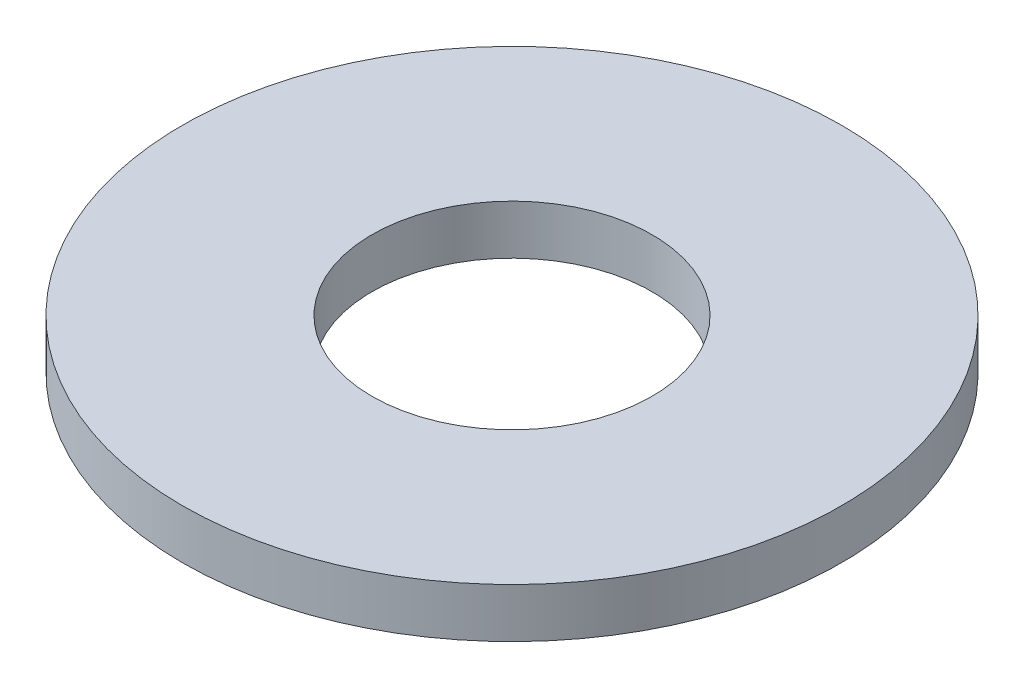
ISO-10303-21;
HEADER;
FILE_DESCRIPTION(('STEP AP214'),'2;1');
FILE_NAME('part.step','',(''),(''),'','','');
FILE_SCHEMA(('AUTOMOTIVE_DESIGN { 1 0 10303 214 1 1 1 1 }'));
ENDSEC;
DATA;
#1=APPLICATION_CONTEXT('core data for automotive mechanical design processes');
#2=APPLICATION_PROTOCOL_DEFINITION('international standard','automotive_design',2000,#1);
#3=PRODUCT_CONTEXT('',#1,'mechanical');
#4=PRODUCT('Part','Part','',(#3));
#5=PRODUCT_RELATED_PRODUCT_CATEGORY('part','',(#4));
#6=PRODUCT_DEFINITION_FORMATION('','',#4);
#7=PRODUCT_DEFINITION_CONTEXT('part definition',#1,'design');
#8=PRODUCT_DEFINITION('design','',#6,#7);
#9=PRODUCT_DEFINITION_SHAPE('','',#8);
#10=(LENGTH_UNIT() NAMED_UNIT(*) SI_UNIT(.MILLI.,.METRE.));
#11=(NAMED_UNIT(*) PLANE_ANGLE_UNIT() SI_UNIT($,.RADIAN.));
#12=(NAMED_UNIT(*) SI_UNIT($,.STERADIAN.) SOLID_ANGLE_UNIT());
#13=UNCERTAINTY_MEASURE_WITH_UNIT(LENGTH_MEASURE(1.E-05),#10,'distance_accuracy_value','');
#14=(GEOMETRIC_REPRESENTATION_CONTEXT(3) GLOBAL_UNCERTAINTY_ASSIGNED_CONTEXT((#13)) GLOBAL_UNIT_ASSIGNED_CONTEXT((#10,
#11,#12)) REPRESENTATION_CONTEXT('',''));
#15=CARTESIAN_POINT('',(0.,0.,0.));
#16=DIRECTION('',(0.,0.,1.));
#17=DIRECTION('',(1.,0.,0.));
#18=AXIS2_PLACEMENT_3D('',#15,#16,#17);
#19=CARTESIAN_POINT('',(0.,6.,0.));
#20=DIRECTION('',(0.,1.,0.));
#21=DIRECTION('',(0.,0.,1.));
#22=AXIS2_PLACEMENT_3D('',#19,#20,#21);
#23=PLANE('',#22);
#24=CARTESIAN_POINT('',(0.,6.,0.));
#25=DIRECTION('',(0.,1.,0.));
#26=DIRECTION('',(0.,0.,1.));
#27=AXIS2_PLACEMENT_3D('',#24,#25,#26);
#28=CIRCLE('',#27,40.);
#29=CARTESIAN_POINT('',(0.,6.,40.));
#30=VERTEX_POINT('',#29);
#31=EDGE_CURVE('E10',#30,#30,#28,.T.);
#32=ORIENTED_EDGE('',*,*,#31,.T.);
#33=EDGE_LOOP('',(#32));
#34=FACE_BOUND('',#33,.T.);
#35=CARTESIAN_POINT('',(0.,6.,0.));
#36=DIRECTION('',(0.,1.,0.));
#37=DIRECTION('',(0.,0.,1.));
#38=AXIS2_PLACEMENT_3D('',#35,#36,#37);
#39=CIRCLE('',#38,17.);
#40=CARTESIAN_POINT('',(0.,6.,17.));
#41=VERTEX_POINT('',#40);
#42=EDGE_CURVE('E42',#41,#41,#39,.T.);
#43=ORIENTED_EDGE('',*,*,#42,.F.);
#44=EDGE_LOOP('',(#43));
#45=FACE_BOUND('',#44,.T.);
#46=ADVANCED_FACE('F31',(#34,#45),#23,.T.);
#47=CARTESIAN_POINT('',(0.,0.,0.));
#48=DIRECTION('',(0.,1.,0.));
#49=DIRECTION('',(0.,0.,1.));
#50=AXIS2_PLACEMENT_3D('',#47,#48,#49);
#51=PLANE('',#50);
#52=CARTESIAN_POINT('',(0.,0.,0.));
#53=DIRECTION('',(0.,1.,0.));
#54=DIRECTION('',(0.,0.,1.));
#55=AXIS2_PLACEMENT_3D('',#52,#53,#54);
#56=CIRCLE('',#55,40.);
#57=CARTESIAN_POINT('',(0.,0.,40.));
#58=VERTEX_POINT('',#57);
#59=EDGE_CURVE('E35',#58,#58,#56,.T.);
#60=ORIENTED_EDGE('',*,*,#59,.F.);
#61=EDGE_LOOP('',(#60));
#62=FACE_BOUND('',#61,.T.);
#63=CARTESIAN_POINT('',(0.,0.,0.));
#64=DIRECTION('',(0.,1.,0.));
#65=DIRECTION('',(0.,0.,1.));
#66=AXIS2_PLACEMENT_3D('',#63,#64,#65);
#67=CIRCLE('',#66,17.);
#68=CARTESIAN_POINT('',(0.,0.,17.));
#69=VERTEX_POINT('',#68);
#70=EDGE_CURVE('E44',#69,#69,#67,.T.);
#71=ORIENTED_EDGE('',*,*,#70,.T.);
#72=EDGE_LOOP('',(#71));
#73=FACE_BOUND('',#72,.T.);
#74=ADVANCED_FACE('F54',(#62,#73),#51,.F.);
#75=CARTESIAN_POINT('',(0.,6.,0.));
#76=DIRECTION('',(0.,-1.,0.));
#77=DIRECTION('',(0.,0.,-1.));
#78=AXIS2_PLACEMENT_3D('',#75,#76,#77);
#79=CYLINDRICAL_SURFACE('',#78,40.);
#80=ORIENTED_EDGE('',*,*,#31,.F.);
#81=EDGE_LOOP('',(#80));
#82=FACE_BOUND('',#81,.T.);
#83=ORIENTED_EDGE('',*,*,#59,.T.);
#84=EDGE_LOOP('',(#83));
#85=FACE_BOUND('',#84,.T.);
#86=ADVANCED_FACE('F33',(#82,#85),#79,.T.);
#87=CARTESIAN_POINT('',(0.,6.,0.));
#88=DIRECTION('',(0.,-1.,0.));
#89=DIRECTION('',(0.,0.,-1.));
#90=AXIS2_PLACEMENT_3D('',#87,#88,#89);
#91=CYLINDRICAL_SURFACE('',#90,17.);
#92=ORIENTED_EDGE('',*,*,#42,.T.);
#93=EDGE_LOOP('',(#92));
#94=FACE_BOUND('',#93,.T.);
#95=ORIENTED_EDGE('',*,*,#70,.F.);
#96=EDGE_LOOP('',(#95));
#97=FACE_BOUND('',#96,.T.);
#98=ADVANCED_FACE('F50',(#94,#97),#91,.F.);
#99=CLOSED_SHELL('',(#46,#74,#86,#98));
#100=MANIFOLD_SOLID_BREP('B2',#99);
#101=ADVANCED_BREP_SHAPE_REPRESENTATION('',(#18,#100),#14);
#102=SHAPE_DEFINITION_REPRESENTATION(#9,#101);
ENDSEC;
END-ISO-10303-21;
